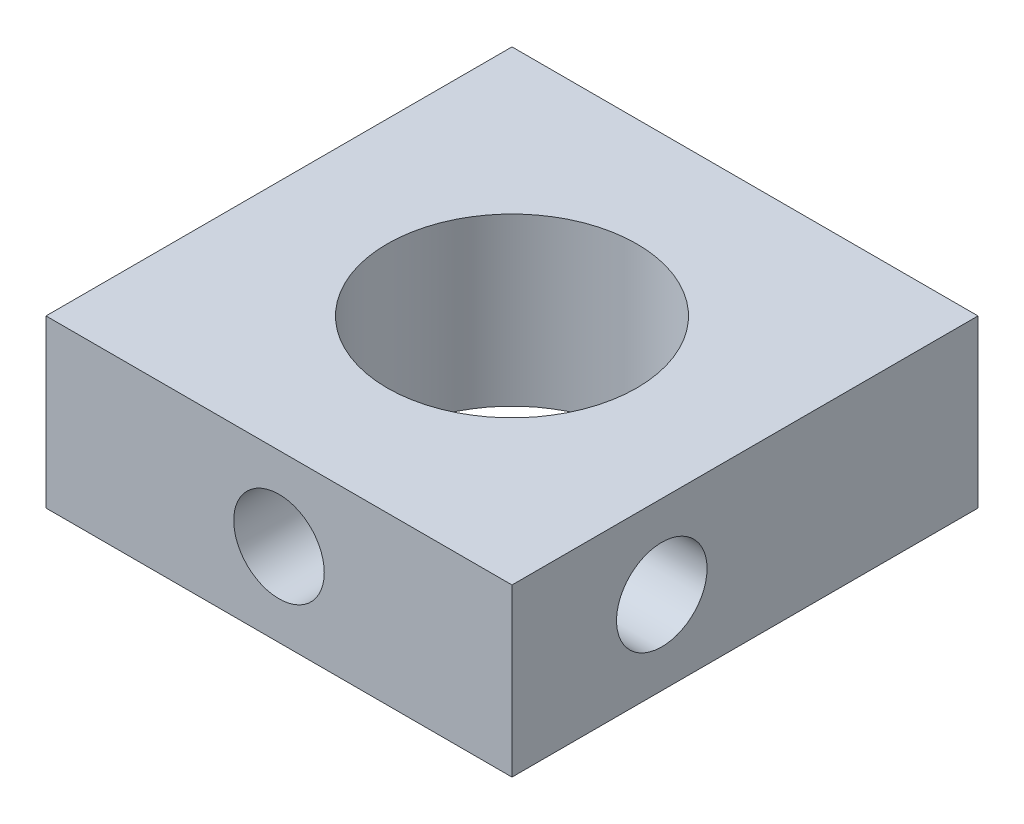
ISO-10303-21;
HEADER;
FILE_DESCRIPTION(('STEP AP214'),'2;1');
FILE_NAME('part.step','',(''),(''),'','','');
FILE_SCHEMA(('AUTOMOTIVE_DESIGN { 1 0 10303 214 1 1 1 1 }'));
ENDSEC;
DATA;
#1=APPLICATION_CONTEXT('core data for automotive mechanical design processes');
#2=APPLICATION_PROTOCOL_DEFINITION('international standard','automotive_design',2000,#1);
#3=PRODUCT_CONTEXT('',#1,'mechanical');
#4=PRODUCT('Part','Part','',(#3));
#5=PRODUCT_RELATED_PRODUCT_CATEGORY('part','',(#4));
#6=PRODUCT_DEFINITION_FORMATION('','',#4);
#7=PRODUCT_DEFINITION_CONTEXT('part definition',#1,'design');
#8=PRODUCT_DEFINITION('design','',#6,#7);
#9=PRODUCT_DEFINITION_SHAPE('','',#8);
#10=(LENGTH_UNIT() NAMED_UNIT(*) SI_UNIT(.MILLI.,.METRE.));
#11=(NAMED_UNIT(*) PLANE_ANGLE_UNIT() SI_UNIT($,.RADIAN.));
#12=(NAMED_UNIT(*) SI_UNIT($,.STERADIAN.) SOLID_ANGLE_UNIT());
#13=UNCERTAINTY_MEASURE_WITH_UNIT(LENGTH_MEASURE(1.E-05),#10,'distance_accuracy_value','');
#14=(GEOMETRIC_REPRESENTATION_CONTEXT(3) GLOBAL_UNCERTAINTY_ASSIGNED_CONTEXT((#13)) GLOBAL_UNIT_ASSIGNED_CONTEXT((#10,
#11,#12)) REPRESENTATION_CONTEXT('',''));
#15=CARTESIAN_POINT('',(0.,0.,0.));
#16=DIRECTION('',(0.,0.,1.));
#17=DIRECTION('',(1.,0.,0.));
#18=AXIS2_PLACEMENT_3D('',#15,#16,#17);
#19=CARTESIAN_POINT('',(0.,6.35,0.));
#20=DIRECTION('',(0.,-1.,0.));
#21=DIRECTION('',(0.,0.,-1.));
#22=AXIS2_PLACEMENT_3D('',#19,#20,#21);
#23=PLANE('',#22);
#24=DIRECTION('',(0.,0.,-1.));
#25=VECTOR('',#24,1.);
#26=CARTESIAN_POINT('',(8.89,6.35,8.89));
#27=LINE('',#26,#25);
#28=CARTESIAN_POINT('',(8.89,6.35,8.89));
#29=VERTEX_POINT('',#28);
#30=CARTESIAN_POINT('',(8.89,6.35,-8.89));
#31=VERTEX_POINT('',#30);
#32=EDGE_CURVE('E144',#29,#31,#27,.T.);
#33=ORIENTED_EDGE('',*,*,#32,.T.);
#34=DIRECTION('',(-1.,0.,0.));
#35=VECTOR('',#34,1.);
#36=CARTESIAN_POINT('',(-8.89,6.35,-8.89));
#37=LINE('',#36,#35);
#38=CARTESIAN_POINT('',(-8.89,6.35,-8.89));
#39=VERTEX_POINT('',#38);
#40=EDGE_CURVE('E99',#31,#39,#37,.T.);
#41=ORIENTED_EDGE('',*,*,#40,.T.);
#42=DIRECTION('',(0.,0.,1.));
#43=VECTOR('',#42,1.);
#44=CARTESIAN_POINT('',(-8.89,6.35,8.89));
#45=LINE('',#44,#43);
#46=CARTESIAN_POINT('',(-8.89,6.35,8.89));
#47=VERTEX_POINT('',#46);
#48=EDGE_CURVE('E149',#39,#47,#45,.T.);
#49=ORIENTED_EDGE('',*,*,#48,.T.);
#50=DIRECTION('',(1.,0.,0.));
#51=VECTOR('',#50,1.);
#52=CARTESIAN_POINT('',(-8.89,6.35,8.89));
#53=LINE('',#52,#51);
#54=EDGE_CURVE('E68',#47,#29,#53,.T.);
#55=ORIENTED_EDGE('',*,*,#54,.T.);
#56=EDGE_LOOP('',(#33,#41,#49,#55));
#57=FACE_BOUND('',#56,.T.);
#58=CARTESIAN_POINT('',(0.,6.35,0.));
#59=DIRECTION('',(0.,1.,0.));
#60=DIRECTION('',(0.,0.,1.));
#61=AXIS2_PLACEMENT_3D('',#58,#59,#60);
#62=CIRCLE('',#61,4.7625);
#63=CARTESIAN_POINT('',(0.,6.35,4.7625));
#64=VERTEX_POINT('',#63);
#65=EDGE_CURVE('E135',#64,#64,#62,.T.);
#66=ORIENTED_EDGE('',*,*,#65,.F.);
#67=EDGE_LOOP('',(#66));
#68=FACE_BOUND('',#67,.T.);
#69=ADVANCED_FACE('F44',(#57,#68),#23,.F.);
#70=CARTESIAN_POINT('',(0.,0.,0.));
#71=DIRECTION('',(0.,-1.,0.));
#72=DIRECTION('',(0.,0.,-1.));
#73=AXIS2_PLACEMENT_3D('',#70,#71,#72);
#74=PLANE('',#73);
#75=DIRECTION('',(0.,0.,-1.));
#76=VECTOR('',#75,1.);
#77=CARTESIAN_POINT('',(8.89,0.,8.89));
#78=LINE('',#77,#76);
#79=CARTESIAN_POINT('',(8.89,0.,8.89));
#80=VERTEX_POINT('',#79);
#81=CARTESIAN_POINT('',(8.89,0.,-8.89));
#82=VERTEX_POINT('',#81);
#83=EDGE_CURVE('E139',#80,#82,#78,.T.);
#84=ORIENTED_EDGE('',*,*,#83,.F.);
#85=DIRECTION('',(1.,0.,0.));
#86=VECTOR('',#85,1.);
#87=CARTESIAN_POINT('',(-8.89,0.,8.89));
#88=LINE('',#87,#86);
#89=CARTESIAN_POINT('',(-8.89,0.,8.89));
#90=VERTEX_POINT('',#89);
#91=EDGE_CURVE('E92',#90,#80,#88,.T.);
#92=ORIENTED_EDGE('',*,*,#91,.F.);
#93=DIRECTION('',(0.,0.,1.));
#94=VECTOR('',#93,1.);
#95=CARTESIAN_POINT('',(-8.89,0.,8.89));
#96=LINE('',#95,#94);
#97=CARTESIAN_POINT('',(-8.89,0.,-8.89));
#98=VERTEX_POINT('',#97);
#99=EDGE_CURVE('E86',#98,#90,#96,.T.);
#100=ORIENTED_EDGE('',*,*,#99,.F.);
#101=DIRECTION('',(-1.,0.,0.));
#102=VECTOR('',#101,1.);
#103=CARTESIAN_POINT('',(-8.89,0.,-8.89));
#104=LINE('',#103,#102);
#105=EDGE_CURVE('E158',#82,#98,#104,.T.);
#106=ORIENTED_EDGE('',*,*,#105,.F.);
#107=EDGE_LOOP('',(#84,#92,#100,#106));
#108=FACE_BOUND('',#107,.T.);
#109=CARTESIAN_POINT('',(0.,0.,0.));
#110=DIRECTION('',(0.,1.,0.));
#111=DIRECTION('',(0.,0.,1.));
#112=AXIS2_PLACEMENT_3D('',#109,#110,#111);
#113=CIRCLE('',#112,4.7625);
#114=CARTESIAN_POINT('',(0.,0.,4.7625));
#115=VERTEX_POINT('',#114);
#116=EDGE_CURVE('E140',#115,#115,#113,.T.);
#117=ORIENTED_EDGE('',*,*,#116,.T.);
#118=EDGE_LOOP('',(#117));
#119=FACE_BOUND('',#118,.T.);
#120=ADVANCED_FACE('F175',(#108,#119),#74,.T.);
#121=CARTESIAN_POINT('',(8.89,6.35,8.89));
#122=DIRECTION('',(-1.,0.,0.));
#123=DIRECTION('',(0.,0.,1.));
#124=AXIS2_PLACEMENT_3D('',#121,#122,#123);
#125=PLANE('',#124);
#126=CARTESIAN_POINT('',(8.89,3.175,3.175));
#127=DIRECTION('',(1.,0.,0.));
#128=DIRECTION('',(0.,0.,-1.));
#129=AXIS2_PLACEMENT_3D('',#126,#127,#128);
#130=CIRCLE('',#129,1.72719999999999);
#131=CARTESIAN_POINT('',(8.89,3.175,1.44780000000001));
#132=VERTEX_POINT('',#131);
#133=EDGE_CURVE('E118',#132,#132,#130,.T.);
#134=ORIENTED_EDGE('',*,*,#133,.F.);
#135=EDGE_LOOP('',(#134));
#136=FACE_BOUND('',#135,.T.);
#137=ORIENTED_EDGE('',*,*,#83,.T.);
#138=DIRECTION('',(0.,-1.,0.));
#139=VECTOR('',#138,1.);
#140=CARTESIAN_POINT('',(8.89,6.35,-8.89));
#141=LINE('',#140,#139);
#142=EDGE_CURVE('E11',#31,#82,#141,.T.);
#143=ORIENTED_EDGE('',*,*,#142,.F.);
#144=ORIENTED_EDGE('',*,*,#32,.F.);
#145=DIRECTION('',(0.,-1.,0.));
#146=VECTOR('',#145,1.);
#147=CARTESIAN_POINT('',(8.89,6.35,8.89));
#148=LINE('',#147,#146);
#149=EDGE_CURVE('E154',#29,#80,#148,.T.);
#150=ORIENTED_EDGE('',*,*,#149,.T.);
#151=EDGE_LOOP('',(#137,#143,#144,#150));
#152=FACE_BOUND('',#151,.T.);
#153=ADVANCED_FACE('F46',(#136,#152),#125,.F.);
#154=CARTESIAN_POINT('',(-8.89,6.35,-8.89));
#155=DIRECTION('',(0.,0.,1.));
#156=DIRECTION('',(1.,0.,0.));
#157=AXIS2_PLACEMENT_3D('',#154,#155,#156);
#158=PLANE('',#157);
#159=ORIENTED_EDGE('',*,*,#105,.T.);
#160=DIRECTION('',(0.,-1.,0.));
#161=VECTOR('',#160,1.);
#162=CARTESIAN_POINT('',(-8.89,6.35,-8.89));
#163=LINE('',#162,#161);
#164=EDGE_CURVE('E60',#39,#98,#163,.T.);
#165=ORIENTED_EDGE('',*,*,#164,.F.);
#166=ORIENTED_EDGE('',*,*,#40,.F.);
#167=ORIENTED_EDGE('',*,*,#142,.T.);
#168=EDGE_LOOP('',(#159,#165,#166,#167));
#169=FACE_BOUND('',#168,.T.);
#170=ADVANCED_FACE('F192',(#169),#158,.F.);
#171=CARTESIAN_POINT('',(-8.89,6.35,8.89));
#172=DIRECTION('',(1.,0.,0.));
#173=DIRECTION('',(0.,0.,-1.));
#174=AXIS2_PLACEMENT_3D('',#171,#172,#173);
#175=PLANE('',#174);
#176=CARTESIAN_POINT('',(-8.89,3.175,3.175));
#177=DIRECTION('',(-1.,0.,0.));
#178=DIRECTION('',(0.,0.,1.));
#179=AXIS2_PLACEMENT_3D('',#176,#177,#178);
#180=CIRCLE('',#179,1.72719999999999);
#181=CARTESIAN_POINT('',(-8.89,3.175,4.90219999999999));
#182=VERTEX_POINT('',#181);
#183=EDGE_CURVE('E117',#182,#182,#180,.T.);
#184=ORIENTED_EDGE('',*,*,#183,.F.);
#185=EDGE_LOOP('',(#184));
#186=FACE_BOUND('',#185,.T.);
#187=ORIENTED_EDGE('',*,*,#99,.T.);
#188=DIRECTION('',(0.,-1.,0.));
#189=VECTOR('',#188,1.);
#190=CARTESIAN_POINT('',(-8.89,6.35,8.89));
#191=LINE('',#190,#189);
#192=EDGE_CURVE('E167',#47,#90,#191,.T.);
#193=ORIENTED_EDGE('',*,*,#192,.F.);
#194=ORIENTED_EDGE('',*,*,#48,.F.);
#195=ORIENTED_EDGE('',*,*,#164,.T.);
#196=EDGE_LOOP('',(#187,#193,#194,#195));
#197=FACE_BOUND('',#196,.T.);
#198=ADVANCED_FACE('F172',(#186,#197),#175,.F.);
#199=CARTESIAN_POINT('',(-8.89,6.35,8.89));
#200=DIRECTION('',(0.,0.,-1.));
#201=DIRECTION('',(-1.,0.,0.));
#202=AXIS2_PLACEMENT_3D('',#199,#200,#201);
#203=PLANE('',#202);
#204=CARTESIAN_POINT('',(0.,3.175,8.89));
#205=DIRECTION('',(0.,0.,1.));
#206=DIRECTION('',(1.,0.,0.));
#207=AXIS2_PLACEMENT_3D('',#204,#205,#206);
#208=CIRCLE('',#207,1.7272);
#209=CARTESIAN_POINT('',(1.7272,3.175,8.89));
#210=VERTEX_POINT('',#209);
#211=EDGE_CURVE('E131',#210,#210,#208,.T.);
#212=ORIENTED_EDGE('',*,*,#211,.F.);
#213=EDGE_LOOP('',(#212));
#214=FACE_BOUND('',#213,.T.);
#215=ORIENTED_EDGE('',*,*,#91,.T.);
#216=ORIENTED_EDGE('',*,*,#149,.F.);
#217=ORIENTED_EDGE('',*,*,#54,.F.);
#218=ORIENTED_EDGE('',*,*,#192,.T.);
#219=EDGE_LOOP('',(#215,#216,#217,#218));
#220=FACE_BOUND('',#219,.T.);
#221=ADVANCED_FACE('F180',(#214,#220),#203,.F.);
#222=CARTESIAN_POINT('',(0.,6.35,0.));
#223=DIRECTION('',(0.,-1.,0.));
#224=DIRECTION('',(0.,0.,-1.));
#225=AXIS2_PLACEMENT_3D('',#222,#223,#224);
#226=CYLINDRICAL_SURFACE('',#225,4.7625);
#227=CARTESIAN_POINT('',(1.7272,3.175,4.43826389593949));
#228=CARTESIAN_POINT('',(1.7272024527368,3.08147498980388,4.43826170076503));
#229=CARTESIAN_POINT('',(1.71957825372233,2.98796673340335,4.44125227087206));
#230=CARTESIAN_POINT('',(1.68941050563446,2.80375466358786,4.45281432649447));
#231=CARTESIAN_POINT('',(1.66686659813383,2.71305091760254,4.46138594608745));
#232=CARTESIAN_POINT('',(1.60778321664955,2.53715457026749,4.48301418156908));
#233=CARTESIAN_POINT('',(1.57127535149555,2.45195002633721,4.49606066132159));
#234=CARTESIAN_POINT('',(1.48541126703648,2.28884325013085,4.5251527778179));
#235=CARTESIAN_POINT('',(1.43605147089428,2.21094305896057,4.54119924914202));
#236=CARTESIAN_POINT('',(1.32342999758053,2.06103953304191,4.57531830276064));
#237=CARTESIAN_POINT('',(1.25966957164587,1.9894237622447,4.59344781013859));
#238=CARTESIAN_POINT('',(1.12111687463677,1.85763092113113,4.6292134595369));
#239=CARTESIAN_POINT('',(1.04632244588852,1.79745609334432,4.64684950425751));
#240=CARTESIAN_POINT('',(0.8849162302688,1.68842006832086,4.68031233770526));
#241=CARTESIAN_POINT('',(0.798006168412935,1.63997547569919,4.6960645355822));
#242=CARTESIAN_POINT('',(0.61659860989443,1.55855301297188,4.723304781633));
#243=CARTESIAN_POINT('',(0.522103573589334,1.52557015106068,4.73479420578928));
#244=CARTESIAN_POINT('',(0.332279703113266,1.47735275783029,4.75181055606693));
#245=CARTESIAN_POINT('',(0.237140482332063,1.461452013056,4.75756062052196));
#246=CARTESIAN_POINT('',(0.0453819346065165,1.44572059541878,4.7632484885006));
#247=CARTESIAN_POINT('',(-0.0512369330673555,1.4458850332327,4.76318806040606));
#248=CARTESIAN_POINT('',(-0.238455394782948,1.461880665219,4.75740656005228));
#249=CARTESIAN_POINT('',(-0.329126502548624,1.47698582695718,4.7519478168455));
#250=CARTESIAN_POINT('',(-0.506546797648019,1.52121920680586,4.73632258069308));
#251=CARTESIAN_POINT('',(-0.593295709282355,1.55034840902435,4.72615575736958));
#252=CARTESIAN_POINT('',(-0.761867255258717,1.62216603644507,4.70194903508485));
#253=CARTESIAN_POINT('',(-0.843602448051957,1.66504112273122,4.68785619025298));
#254=CARTESIAN_POINT('',(-0.998915520069442,1.7629720701783,4.65723624072518));
#255=CARTESIAN_POINT('',(-1.0724908560108,1.81803171312239,4.64070838079468));
#256=CARTESIAN_POINT('',(-1.21368780451131,1.94231739807278,4.60586004779148));
#257=CARTESIAN_POINT('',(-1.28075862488538,2.01215648202074,4.58749097922053));
#258=CARTESIAN_POINT('',(-1.40243506145783,2.16221694100143,4.55177029542519));
#259=CARTESIAN_POINT('',(-1.45703795078785,2.24244058124635,4.53441890339291));
#260=CARTESIAN_POINT('',(-1.55318831431885,2.41303276059363,4.50240377836791));
#261=CARTESIAN_POINT('',(-1.59445924480796,2.50356917415452,4.48779931857895));
#262=CARTESIAN_POINT('',(-1.66096705219199,2.69097464045876,4.46361535222921));
#263=CARTESIAN_POINT('',(-1.68621216073413,2.78784041388538,4.45403326637282));
#264=CARTESIAN_POINT('',(-1.71873956307094,2.97974205010188,4.44157966352425));
#265=CARTESIAN_POINT('',(-1.72689070574209,3.074609501934,4.43838397237577));
#266=CARTESIAN_POINT('',(-1.72749177863266,3.26438987243235,4.43815063581911));
#267=CARTESIAN_POINT('',(-1.71994527875206,3.3593027758545,4.44111159028922));
#268=CARTESIAN_POINT('',(-1.69015114043404,3.54218420914205,4.45253046050549));
#269=CARTESIAN_POINT('',(-1.66855346979375,3.63027554039076,4.46074508377625));
#270=CARTESIAN_POINT('',(-1.61207609237181,3.80155117283182,4.48146351831711));
#271=CARTESIAN_POINT('',(-1.5771937724772,3.88473450489221,4.49396817339569));
#272=CARTESIAN_POINT('',(-1.4937258238269,4.04714496168185,4.52241023957861));
#273=CARTESIAN_POINT('',(-1.44469384268603,4.12612341785869,4.53845462567933));
#274=CARTESIAN_POINT('',(-1.33480249857167,4.27504197107228,4.57198033021323));
#275=CARTESIAN_POINT('',(-1.27393905489091,4.3449789357742,4.58946214321548));
#276=CARTESIAN_POINT('',(-1.13788812985202,4.47807543297262,4.62513115095273));
#277=CARTESIAN_POINT('',(-1.06207032390726,4.54059777502578,4.6432996606783));
#278=CARTESIAN_POINT('',(-0.900571093459922,4.65209778147633,4.6773045937269));
#279=CARTESIAN_POINT('',(-0.814889778632478,4.70107559645853,4.69314104297631));
#280=CARTESIAN_POINT('',(-0.636285986394659,4.78372400027347,4.72066340402786));
#281=CARTESIAN_POINT('',(-0.5433991533777,4.81746493099547,4.73236833332832));
#282=CARTESIAN_POINT('',(-0.352750974361674,4.86866970615501,4.75038126613645));
#283=CARTESIAN_POINT('',(-0.254991772646446,4.88614064537755,4.75669162193395));
#284=CARTESIAN_POINT('',(-0.0631529693710949,4.9035820709106,4.76299521092939));
#285=CARTESIAN_POINT('',(0.0308341067488615,4.9044604276609,4.76331614558786));
#286=CARTESIAN_POINT('',(0.217556559086098,4.89099766054948,4.75844456752879));
#287=CARTESIAN_POINT('',(0.310292069068738,4.87665817640223,4.7532526488183));
#288=CARTESIAN_POINT('',(0.48985343642398,4.83379571766986,4.73808000673232));
#289=CARTESIAN_POINT('',(0.576763713017683,4.80558608787764,4.72820524248539));
#290=CARTESIAN_POINT('',(0.744633743801229,4.73608872682683,4.70469111891116));
#291=CARTESIAN_POINT('',(0.825592374345773,4.69479853378646,4.69105105101021));
#292=CARTESIAN_POINT('',(0.982864628077256,4.59839296893058,4.66069310838836));
#293=CARTESIAN_POINT('',(1.05885511954382,4.54278333450336,4.64387256633662));
#294=CARTESIAN_POINT('',(1.20071184893347,4.42011476510012,4.6092340536962));
#295=CARTESIAN_POINT('',(1.26657456141553,4.35305186035272,4.59141573871762));
#296=CARTESIAN_POINT('',(1.38958521655538,4.20550308174843,4.55573955664315));
#297=CARTESIAN_POINT('',(1.44615494259525,4.12452365663368,4.53792175427281));
#298=CARTESIAN_POINT('',(1.5448849649361,3.95364289542013,4.50526934573013));
#299=CARTESIAN_POINT('',(1.58704550749889,3.86374171183358,4.4904346885758));
#300=CARTESIAN_POINT('',(1.65604477445503,3.67589988212569,4.46545673639148));
#301=CARTESIAN_POINT('',(1.68262483133597,3.57785277808411,4.45539314541034));
#302=CARTESIAN_POINT('',(1.7181963052983,3.37819587485289,4.44179970294281));
#303=CARTESIAN_POINT('',(1.72719733580613,3.27658805387631,4.43826628036588));
#304=CARTESIAN_POINT('',(1.7272,3.175,4.43826389593949));
#305=B_SPLINE_CURVE_WITH_KNOTS('',3,(#227,#228,#229,#230,#231,#232,#233,#234,#235,#236,#237,
#238,#239,#240,#241,#242,#243,#244,#245,#246,#247,#248,#249,#250,#251,#252,#253,#254,#255,#256,
#257,#258,#259,#260,#261,#262,#263,#264,#265,#266,#267,#268,#269,#270,#271,#272,#273,#274,#275,
#276,#277,#278,#279,#280,#281,#282,#283,#284,#285,#286,#287,#288,#289,#290,#291,#292,#293,#294,
#295,#296,#297,#298,#299,#300,#301,#302,#303,#304),.UNSPECIFIED.,.T.,.F.,(4,2,2,2,2,2,2,2,2,2,2,
2,2,2,2,2,2,2,2,2,2,2,2,2,2,2,2,2,2,2,2,2,2,2,2,2,2,2,4),(0.,0.28019737711642,0.560401485866796,
0.83997504241816,1.11962649076282,1.41107897984469,1.7025885375201,2.00329061840768,
2.30389555093068,2.59229594586659,2.88060856848309,3.15556663367878,3.43054399630027,
3.70942590205295,3.98839448751232,4.28272167255984,4.57711316854827,4.87726856373806,
5.17726965939737,5.46161111225916,5.74588790830588,6.01786922644992,6.28990407143388,
6.5716894303409,6.8535721508638,7.15197079247293,7.45036611642391,7.7473694353212,
8.04424318053447,8.32482325988272,8.60537310994208,8.87985756501396,9.15439370919544,
9.4401028087806,9.72591113856107,10.0255929919408,10.3252697233174,10.6297902525018,
10.9341442021331),.UNSPECIFIED.);
#306=CARTESIAN_POINT('',(1.7272,3.175,4.43826389593949));
#307=VERTEX_POINT('',#306);
#308=EDGE_CURVE('E48',#307,#307,#305,.T.);
#309=ORIENTED_EDGE('',*,*,#308,.F.);
#310=EDGE_LOOP('',(#309));
#311=FACE_BOUND('',#310,.T.);
#312=ORIENTED_EDGE('',*,*,#65,.T.);
#313=EDGE_LOOP('',(#312));
#314=FACE_BOUND('',#313,.T.);
#315=ORIENTED_EDGE('',*,*,#116,.F.);
#316=EDGE_LOOP('',(#315));
#317=FACE_BOUND('',#316,.T.);
#318=ADVANCED_FACE('F182',(#311,#314,#317),#226,.F.);
#319=CARTESIAN_POINT('',(0.,3.175,8.89));
#320=DIRECTION('',(0.,0.,1.));
#321=DIRECTION('',(1.,0.,0.));
#322=AXIS2_PLACEMENT_3D('',#319,#320,#321);
#323=CYLINDRICAL_SURFACE('',#322,1.7272);
#324=ORIENTED_EDGE('',*,*,#308,.T.);
#325=EDGE_LOOP('',(#324));
#326=FACE_BOUND('',#325,.T.);
#327=ORIENTED_EDGE('',*,*,#211,.T.);
#328=EDGE_LOOP('',(#327));
#329=FACE_BOUND('',#328,.T.);
#330=ADVANCED_FACE('F189',(#326,#329),#323,.F.);
#331=CARTESIAN_POINT('',(-5.07999999999999,3.175,3.175));
#332=DIRECTION('',(-1.,0.,0.));
#333=DIRECTION('',(0.,0.,1.));
#334=AXIS2_PLACEMENT_3D('',#331,#332,#333);
#335=CONICAL_SURFACE('',#334,1.7272,1.02974425867665);
#336=CARTESIAN_POINT('',(-4.04219353881559,3.175,3.175));
#337=VERTEX_POINT('',#336);
#338=VERTEX_LOOP('',#337);
#339=FACE_BOUND('',#338,.T.);
#340=CARTESIAN_POINT('',(-5.07999999999999,3.175,3.175));
#341=DIRECTION('',(-1.,0.,0.));
#342=DIRECTION('',(0.,0.,1.));
#343=AXIS2_PLACEMENT_3D('',#340,#341,#342);
#344=CIRCLE('',#343,1.7272);
#345=CARTESIAN_POINT('',(-5.07999999999999,3.175,4.9022));
#346=VERTEX_POINT('',#345);
#347=EDGE_CURVE('E123',#346,#346,#344,.T.);
#348=ORIENTED_EDGE('',*,*,#347,.T.);
#349=EDGE_LOOP('',(#348));
#350=FACE_BOUND('',#349,.T.);
#351=ADVANCED_FACE('F206',(#339,#350),#335,.F.);
#352=CARTESIAN_POINT('',(-8.89,3.175,3.175));
#353=DIRECTION('',(-1.,0.,0.));
#354=DIRECTION('',(0.,0.,1.));
#355=AXIS2_PLACEMENT_3D('',#352,#353,#354);
#356=CYLINDRICAL_SURFACE('',#355,1.72719999999999);
#357=ORIENTED_EDGE('',*,*,#347,.F.);
#358=EDGE_LOOP('',(#357));
#359=FACE_BOUND('',#358,.T.);
#360=ORIENTED_EDGE('',*,*,#183,.T.);
#361=EDGE_LOOP('',(#360));
#362=FACE_BOUND('',#361,.T.);
#363=ADVANCED_FACE('F110',(#359,#362),#356,.F.);
#364=CARTESIAN_POINT('',(5.07999999999999,3.175,3.175));
#365=DIRECTION('',(1.,0.,0.));
#366=DIRECTION('',(0.,0.,-1.));
#367=AXIS2_PLACEMENT_3D('',#364,#365,#366);
#368=CONICAL_SURFACE('',#367,1.7272,1.02974425867665);
#369=CARTESIAN_POINT('',(4.04219353881559,3.175,3.175));
#370=VERTEX_POINT('',#369);
#371=VERTEX_LOOP('',#370);
#372=FACE_BOUND('',#371,.T.);
#373=CARTESIAN_POINT('',(5.07999999999999,3.175,3.175));
#374=DIRECTION('',(1.,0.,0.));
#375=DIRECTION('',(0.,0.,-1.));
#376=AXIS2_PLACEMENT_3D('',#373,#374,#375);
#377=CIRCLE('',#376,1.7272);
#378=CARTESIAN_POINT('',(5.07999999999999,3.175,1.4478));
#379=VERTEX_POINT('',#378);
#380=EDGE_CURVE('E114',#379,#379,#377,.T.);
#381=ORIENTED_EDGE('',*,*,#380,.T.);
#382=EDGE_LOOP('',(#381));
#383=FACE_BOUND('',#382,.T.);
#384=ADVANCED_FACE('F106',(#372,#383),#368,.F.);
#385=CARTESIAN_POINT('',(8.89,3.175,3.175));
#386=DIRECTION('',(1.,0.,0.));
#387=DIRECTION('',(0.,0.,-1.));
#388=AXIS2_PLACEMENT_3D('',#385,#386,#387);
#389=CYLINDRICAL_SURFACE('',#388,1.72719999999999);
#390=ORIENTED_EDGE('',*,*,#380,.F.);
#391=EDGE_LOOP('',(#390));
#392=FACE_BOUND('',#391,.T.);
#393=ORIENTED_EDGE('',*,*,#133,.T.);
#394=EDGE_LOOP('',(#393));
#395=FACE_BOUND('',#394,.T.);
#396=ADVANCED_FACE('F109',(#392,#395),#389,.F.);
#397=CLOSED_SHELL('',(#69,#120,#153,#170,#198,#221,#318,#330,#351,#363,#384,#396));
#398=MANIFOLD_SOLID_BREP('B2',#397);
#399=ADVANCED_BREP_SHAPE_REPRESENTATION('',(#18,#398),#14);
#400=SHAPE_DEFINITION_REPRESENTATION(#9,#399);
ENDSEC;
END-ISO-10303-21;
